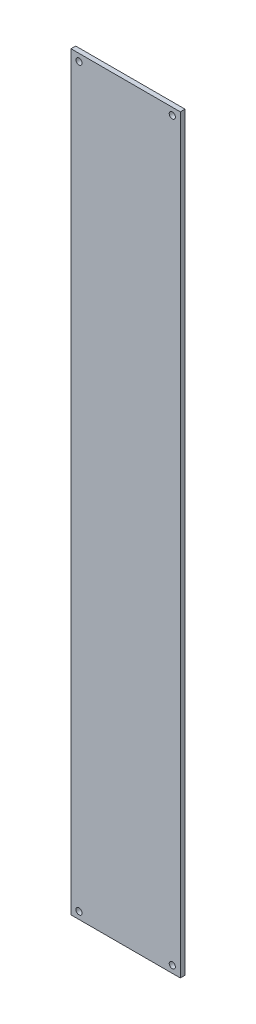
ISO-10303-21;
HEADER;
FILE_DESCRIPTION(('STEP AP214'),'2;1');
FILE_NAME('part.step','',(''),(''),'','','');
FILE_SCHEMA(('AUTOMOTIVE_DESIGN { 1 0 10303 214 1 1 1 1 }'));
ENDSEC;
DATA;
#1=APPLICATION_CONTEXT('core data for automotive mechanical design processes');
#2=APPLICATION_PROTOCOL_DEFINITION('international standard','automotive_design',2000,#1);
#3=PRODUCT_CONTEXT('',#1,'mechanical');
#4=PRODUCT('Part','Part','',(#3));
#5=PRODUCT_RELATED_PRODUCT_CATEGORY('part','',(#4));
#6=PRODUCT_DEFINITION_FORMATION('','',#4);
#7=PRODUCT_DEFINITION_CONTEXT('part definition',#1,'design');
#8=PRODUCT_DEFINITION('design','',#6,#7);
#9=PRODUCT_DEFINITION_SHAPE('','',#8);
#10=(LENGTH_UNIT() NAMED_UNIT(*) SI_UNIT(.MILLI.,.METRE.));
#11=(NAMED_UNIT(*) PLANE_ANGLE_UNIT() SI_UNIT($,.RADIAN.));
#12=(NAMED_UNIT(*) SI_UNIT($,.STERADIAN.) SOLID_ANGLE_UNIT());
#13=UNCERTAINTY_MEASURE_WITH_UNIT(LENGTH_MEASURE(1.E-05),#10,'distance_accuracy_value','');
#14=(GEOMETRIC_REPRESENTATION_CONTEXT(3) GLOBAL_UNCERTAINTY_ASSIGNED_CONTEXT((#13)) GLOBAL_UNIT_ASSIGNED_CONTEXT((#10,
#11,#12)) REPRESENTATION_CONTEXT('',''));
#15=CARTESIAN_POINT('',(0.,0.,0.));
#16=DIRECTION('',(0.,0.,1.));
#17=DIRECTION('',(1.,0.,0.));
#18=AXIS2_PLACEMENT_3D('',#15,#16,#17);
#19=CARTESIAN_POINT('',(-118.5,-197.5,0.));
#20=DIRECTION('',(0.,-1.,0.));
#21=DIRECTION('',(0.,0.,-1.));
#22=AXIS2_PLACEMENT_3D('',#19,#20,#21);
#23=PLANE('',#22);
#24=DIRECTION('',(1.,0.,0.));
#25=VECTOR('',#24,1.);
#26=CARTESIAN_POINT('',(-118.5,-197.5,5.));
#27=LINE('',#26,#25);
#28=CARTESIAN_POINT('',(-118.5,-197.5,5.));
#29=VERTEX_POINT('',#28);
#30=CARTESIAN_POINT('',(-2.5,-197.5,5.));
#31=VERTEX_POINT('',#30);
#32=EDGE_CURVE('E98',#29,#31,#27,.T.);
#33=ORIENTED_EDGE('',*,*,#32,.F.);
#34=DIRECTION('',(0.,0.,1.));
#35=VECTOR('',#34,1.);
#36=CARTESIAN_POINT('',(-118.5,-197.5,0.));
#37=LINE('',#36,#35);
#38=CARTESIAN_POINT('',(-118.5,-197.5,0.));
#39=VERTEX_POINT('',#38);
#40=EDGE_CURVE('E11',#39,#29,#37,.T.);
#41=ORIENTED_EDGE('',*,*,#40,.F.);
#42=DIRECTION('',(1.,0.,0.));
#43=VECTOR('',#42,1.);
#44=CARTESIAN_POINT('',(-118.5,-197.5,0.));
#45=LINE('',#44,#43);
#46=CARTESIAN_POINT('',(-2.5,-197.5,0.));
#47=VERTEX_POINT('',#46);
#48=EDGE_CURVE('E91',#39,#47,#45,.T.);
#49=ORIENTED_EDGE('',*,*,#48,.T.);
#50=DIRECTION('',(0.,0.,1.));
#51=VECTOR('',#50,1.);
#52=CARTESIAN_POINT('',(-2.5,-197.5,0.));
#53=LINE('',#52,#51);
#54=EDGE_CURVE('E36',#47,#31,#53,.T.);
#55=ORIENTED_EDGE('',*,*,#54,.T.);
#56=EDGE_LOOP('',(#33,#41,#49,#55));
#57=FACE_BOUND('',#56,.T.);
#58=ADVANCED_FACE('F33',(#57),#23,.T.);
#59=CARTESIAN_POINT('',(-118.5,598.5,0.));
#60=DIRECTION('',(-1.,0.,0.));
#61=DIRECTION('',(0.,-1.,0.));
#62=AXIS2_PLACEMENT_3D('',#59,#60,#61);
#63=PLANE('',#62);
#64=DIRECTION('',(0.,-1.,0.));
#65=VECTOR('',#64,1.);
#66=CARTESIAN_POINT('',(-118.5,598.5,5.));
#67=LINE('',#66,#65);
#68=CARTESIAN_POINT('',(-118.5,598.5,5.));
#69=VERTEX_POINT('',#68);
#70=EDGE_CURVE('E93',#69,#29,#67,.T.);
#71=ORIENTED_EDGE('',*,*,#70,.F.);
#72=DIRECTION('',(0.,0.,1.));
#73=VECTOR('',#72,1.);
#74=CARTESIAN_POINT('',(-118.5,598.5,0.));
#75=LINE('',#74,#73);
#76=CARTESIAN_POINT('',(-118.5,598.5,0.));
#77=VERTEX_POINT('',#76);
#78=EDGE_CURVE('E42',#77,#69,#75,.T.);
#79=ORIENTED_EDGE('',*,*,#78,.F.);
#80=DIRECTION('',(0.,-1.,0.));
#81=VECTOR('',#80,1.);
#82=CARTESIAN_POINT('',(-118.5,598.5,0.));
#83=LINE('',#82,#81);
#84=EDGE_CURVE('E88',#77,#39,#83,.T.);
#85=ORIENTED_EDGE('',*,*,#84,.T.);
#86=ORIENTED_EDGE('',*,*,#40,.T.);
#87=EDGE_LOOP('',(#71,#79,#85,#86));
#88=FACE_BOUND('',#87,.T.);
#89=ADVANCED_FACE('F109',(#88),#63,.T.);
#90=CARTESIAN_POINT('',(-2.5,598.5,0.));
#91=DIRECTION('',(0.,1.,0.));
#92=DIRECTION('',(0.,0.,1.));
#93=AXIS2_PLACEMENT_3D('',#90,#91,#92);
#94=PLANE('',#93);
#95=DIRECTION('',(-1.,0.,0.));
#96=VECTOR('',#95,1.);
#97=CARTESIAN_POINT('',(-2.5,598.5,5.));
#98=LINE('',#97,#96);
#99=CARTESIAN_POINT('',(-2.5,598.5,5.));
#100=VERTEX_POINT('',#99);
#101=EDGE_CURVE('E83',#100,#69,#98,.T.);
#102=ORIENTED_EDGE('',*,*,#101,.F.);
#103=DIRECTION('',(0.,0.,1.));
#104=VECTOR('',#103,1.);
#105=CARTESIAN_POINT('',(-2.5,598.5,0.));
#106=LINE('',#105,#104);
#107=CARTESIAN_POINT('',(-2.5,598.5,0.));
#108=VERTEX_POINT('',#107);
#109=EDGE_CURVE('E78',#108,#100,#106,.T.);
#110=ORIENTED_EDGE('',*,*,#109,.F.);
#111=DIRECTION('',(-1.,0.,0.));
#112=VECTOR('',#111,1.);
#113=CARTESIAN_POINT('',(-2.5,598.5,0.));
#114=LINE('',#113,#112);
#115=EDGE_CURVE('E81',#108,#77,#114,.T.);
#116=ORIENTED_EDGE('',*,*,#115,.T.);
#117=ORIENTED_EDGE('',*,*,#78,.T.);
#118=EDGE_LOOP('',(#102,#110,#116,#117));
#119=FACE_BOUND('',#118,.T.);
#120=ADVANCED_FACE('F80',(#119),#94,.T.);
#121=CARTESIAN_POINT('',(-2.5,-197.5,0.));
#122=DIRECTION('',(1.,0.,0.));
#123=DIRECTION('',(0.,0.,-1.));
#124=AXIS2_PLACEMENT_3D('',#121,#122,#123);
#125=PLANE('',#124);
#126=DIRECTION('',(0.,1.,0.));
#127=VECTOR('',#126,1.);
#128=CARTESIAN_POINT('',(-2.5,-197.5,5.));
#129=LINE('',#128,#127);
#130=EDGE_CURVE('E101',#31,#100,#129,.T.);
#131=ORIENTED_EDGE('',*,*,#130,.F.);
#132=ORIENTED_EDGE('',*,*,#54,.F.);
#133=DIRECTION('',(0.,1.,0.));
#134=VECTOR('',#133,1.);
#135=CARTESIAN_POINT('',(-2.5,-197.5,0.));
#136=LINE('',#135,#134);
#137=EDGE_CURVE('E87',#47,#108,#136,.T.);
#138=ORIENTED_EDGE('',*,*,#137,.T.);
#139=ORIENTED_EDGE('',*,*,#109,.T.);
#140=EDGE_LOOP('',(#131,#132,#138,#139));
#141=FACE_BOUND('',#140,.T.);
#142=ADVANCED_FACE('F90',(#141),#125,.T.);
#143=CARTESIAN_POINT('',(0.,0.,0.));
#144=DIRECTION('',(0.,0.,1.));
#145=DIRECTION('',(1.,0.,0.));
#146=AXIS2_PLACEMENT_3D('',#143,#144,#145);
#147=PLANE('',#146);
#148=CARTESIAN_POINT('',(-11.,-190.,0.));
#149=DIRECTION('',(0.,0.,1.));
#150=DIRECTION('',(-1.,0.,0.));
#151=AXIS2_PLACEMENT_3D('',#148,#149,#150);
#152=CIRCLE('',#151,3.25);
#153=CARTESIAN_POINT('',(-14.25,-190.,0.));
#154=VERTEX_POINT('',#153);
#155=EDGE_CURVE('E150',#154,#154,#152,.T.);
#156=ORIENTED_EDGE('',*,*,#155,.T.);
#157=EDGE_LOOP('',(#156));
#158=FACE_BOUND('',#157,.T.);
#159=CARTESIAN_POINT('',(-11.,591.,0.));
#160=DIRECTION('',(0.,0.,1.));
#161=DIRECTION('',(-1.,0.,0.));
#162=AXIS2_PLACEMENT_3D('',#159,#160,#161);
#163=CIRCLE('',#162,3.24999999999999);
#164=CARTESIAN_POINT('',(-14.25,591.,0.));
#165=VERTEX_POINT('',#164);
#166=EDGE_CURVE('E158',#165,#165,#163,.T.);
#167=ORIENTED_EDGE('',*,*,#166,.T.);
#168=EDGE_LOOP('',(#167));
#169=FACE_BOUND('',#168,.T.);
#170=CARTESIAN_POINT('',(-110.,591.,0.));
#171=DIRECTION('',(0.,0.,1.));
#172=DIRECTION('',(-1.,0.,0.));
#173=AXIS2_PLACEMENT_3D('',#170,#171,#172);
#174=CIRCLE('',#173,3.24999999999999);
#175=CARTESIAN_POINT('',(-113.25,591.,0.));
#176=VERTEX_POINT('',#175);
#177=EDGE_CURVE('E164',#176,#176,#174,.T.);
#178=ORIENTED_EDGE('',*,*,#177,.T.);
#179=EDGE_LOOP('',(#178));
#180=FACE_BOUND('',#179,.T.);
#181=CARTESIAN_POINT('',(-110.,-190.,0.));
#182=DIRECTION('',(0.,0.,1.));
#183=DIRECTION('',(-1.,0.,0.));
#184=AXIS2_PLACEMENT_3D('',#181,#182,#183);
#185=CIRCLE('',#184,3.25);
#186=CARTESIAN_POINT('',(-113.25,-190.,0.));
#187=VERTEX_POINT('',#186);
#188=EDGE_CURVE('E102',#187,#187,#185,.T.);
#189=ORIENTED_EDGE('',*,*,#188,.T.);
#190=EDGE_LOOP('',(#189));
#191=FACE_BOUND('',#190,.T.);
#192=ORIENTED_EDGE('',*,*,#48,.F.);
#193=ORIENTED_EDGE('',*,*,#84,.F.);
#194=ORIENTED_EDGE('',*,*,#115,.F.);
#195=ORIENTED_EDGE('',*,*,#137,.F.);
#196=EDGE_LOOP('',(#192,#193,#194,#195));
#197=FACE_BOUND('',#196,.T.);
#198=ADVANCED_FACE('F86',(#158,#169,#180,#191,#197),#147,.F.);
#199=CARTESIAN_POINT('',(0.,0.,5.));
#200=DIRECTION('',(0.,0.,1.));
#201=DIRECTION('',(1.,0.,0.));
#202=AXIS2_PLACEMENT_3D('',#199,#200,#201);
#203=PLANE('',#202);
#204=CARTESIAN_POINT('',(-11.,-190.,5.));
#205=DIRECTION('',(0.,0.,1.));
#206=DIRECTION('',(-1.,0.,0.));
#207=AXIS2_PLACEMENT_3D('',#204,#205,#206);
#208=CIRCLE('',#207,3.25);
#209=CARTESIAN_POINT('',(-14.25,-190.,5.));
#210=VERTEX_POINT('',#209);
#211=EDGE_CURVE('E153',#210,#210,#208,.T.);
#212=ORIENTED_EDGE('',*,*,#211,.F.);
#213=EDGE_LOOP('',(#212));
#214=FACE_BOUND('',#213,.T.);
#215=CARTESIAN_POINT('',(-11.,591.,5.));
#216=DIRECTION('',(0.,0.,1.));
#217=DIRECTION('',(-1.,0.,0.));
#218=AXIS2_PLACEMENT_3D('',#215,#216,#217);
#219=CIRCLE('',#218,3.24999999999999);
#220=CARTESIAN_POINT('',(-14.25,591.,5.));
#221=VERTEX_POINT('',#220);
#222=EDGE_CURVE('E155',#221,#221,#219,.T.);
#223=ORIENTED_EDGE('',*,*,#222,.F.);
#224=EDGE_LOOP('',(#223));
#225=FACE_BOUND('',#224,.T.);
#226=CARTESIAN_POINT('',(-110.,591.,5.));
#227=DIRECTION('',(0.,0.,1.));
#228=DIRECTION('',(-1.,0.,0.));
#229=AXIS2_PLACEMENT_3D('',#226,#227,#228);
#230=CIRCLE('',#229,3.24999999999999);
#231=CARTESIAN_POINT('',(-113.25,591.,5.));
#232=VERTEX_POINT('',#231);
#233=EDGE_CURVE('E161',#232,#232,#230,.T.);
#234=ORIENTED_EDGE('',*,*,#233,.F.);
#235=EDGE_LOOP('',(#234));
#236=FACE_BOUND('',#235,.T.);
#237=CARTESIAN_POINT('',(-110.,-190.,5.));
#238=DIRECTION('',(0.,0.,1.));
#239=DIRECTION('',(-1.,0.,0.));
#240=AXIS2_PLACEMENT_3D('',#237,#238,#239);
#241=CIRCLE('',#240,3.25);
#242=CARTESIAN_POINT('',(-113.25,-190.,5.));
#243=VERTEX_POINT('',#242);
#244=EDGE_CURVE('E167',#243,#243,#241,.T.);
#245=ORIENTED_EDGE('',*,*,#244,.F.);
#246=EDGE_LOOP('',(#245));
#247=FACE_BOUND('',#246,.T.);
#248=ORIENTED_EDGE('',*,*,#32,.T.);
#249=ORIENTED_EDGE('',*,*,#130,.T.);
#250=ORIENTED_EDGE('',*,*,#101,.T.);
#251=ORIENTED_EDGE('',*,*,#70,.T.);
#252=EDGE_LOOP('',(#248,#249,#250,#251));
#253=FACE_BOUND('',#252,.T.);
#254=ADVANCED_FACE('F108',(#214,#225,#236,#247,#253),#203,.T.);
#255=CARTESIAN_POINT('',(-110.,-190.,0.));
#256=DIRECTION('',(0.,0.,1.));
#257=DIRECTION('',(1.,0.,0.));
#258=AXIS2_PLACEMENT_3D('',#255,#256,#257);
#259=CYLINDRICAL_SURFACE('',#258,3.25);
#260=ORIENTED_EDGE('',*,*,#188,.F.);
#261=EDGE_LOOP('',(#260));
#262=FACE_BOUND('',#261,.T.);
#263=ORIENTED_EDGE('',*,*,#244,.T.);
#264=EDGE_LOOP('',(#263));
#265=FACE_BOUND('',#264,.T.);
#266=ADVANCED_FACE('F127',(#262,#265),#259,.F.);
#267=CARTESIAN_POINT('',(-110.,591.,0.));
#268=DIRECTION('',(0.,0.,1.));
#269=DIRECTION('',(1.,0.,0.));
#270=AXIS2_PLACEMENT_3D('',#267,#268,#269);
#271=CYLINDRICAL_SURFACE('',#270,3.24999999999999);
#272=ORIENTED_EDGE('',*,*,#177,.F.);
#273=EDGE_LOOP('',(#272));
#274=FACE_BOUND('',#273,.T.);
#275=ORIENTED_EDGE('',*,*,#233,.T.);
#276=EDGE_LOOP('',(#275));
#277=FACE_BOUND('',#276,.T.);
#278=ADVANCED_FACE('F134',(#274,#277),#271,.F.);
#279=CARTESIAN_POINT('',(-11.,591.,0.));
#280=DIRECTION('',(0.,0.,1.));
#281=DIRECTION('',(1.,0.,0.));
#282=AXIS2_PLACEMENT_3D('',#279,#280,#281);
#283=CYLINDRICAL_SURFACE('',#282,3.24999999999999);
#284=ORIENTED_EDGE('',*,*,#166,.F.);
#285=EDGE_LOOP('',(#284));
#286=FACE_BOUND('',#285,.T.);
#287=ORIENTED_EDGE('',*,*,#222,.T.);
#288=EDGE_LOOP('',(#287));
#289=FACE_BOUND('',#288,.T.);
#290=ADVANCED_FACE('F138',(#286,#289),#283,.F.);
#291=CARTESIAN_POINT('',(-11.,-190.,0.));
#292=DIRECTION('',(0.,0.,1.));
#293=DIRECTION('',(1.,0.,0.));
#294=AXIS2_PLACEMENT_3D('',#291,#292,#293);
#295=CYLINDRICAL_SURFACE('',#294,3.25);
#296=ORIENTED_EDGE('',*,*,#155,.F.);
#297=EDGE_LOOP('',(#296));
#298=FACE_BOUND('',#297,.T.);
#299=ORIENTED_EDGE('',*,*,#211,.T.);
#300=EDGE_LOOP('',(#299));
#301=FACE_BOUND('',#300,.T.);
#302=ADVANCED_FACE('F142',(#298,#301),#295,.F.);
#303=CLOSED_SHELL('',(#58,#89,#120,#142,#198,#254,#266,#278,#290,#302));
#304=MANIFOLD_SOLID_BREP('B2',#303);
#305=ADVANCED_BREP_SHAPE_REPRESENTATION('',(#18,#304),#14);
#306=SHAPE_DEFINITION_REPRESENTATION(#9,#305);
ENDSEC;
END-ISO-10303-21;
